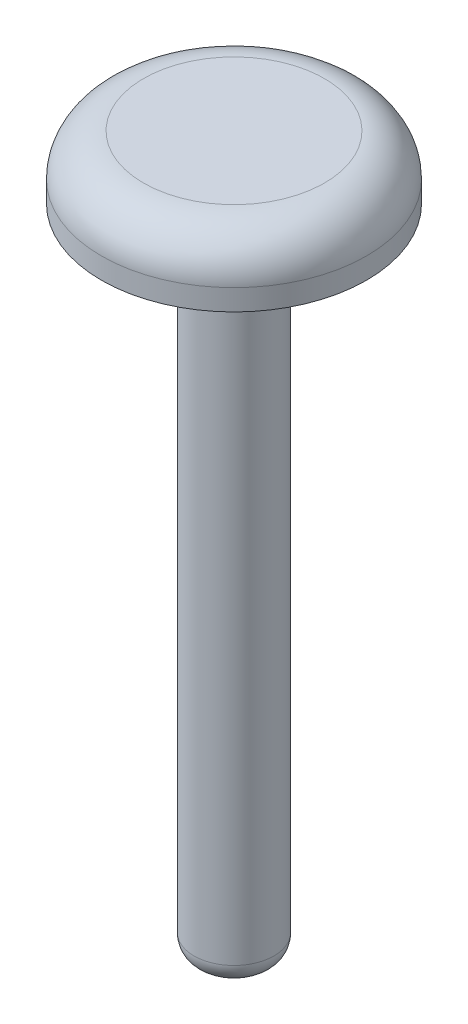
ISO-10303-21;
HEADER;
FILE_DESCRIPTION(('STEP AP214'),'2;1');
FILE_NAME('part.step','',(''),(''),'','','');
FILE_SCHEMA(('AUTOMOTIVE_DESIGN { 1 0 10303 214 1 1 1 1 }'));
ENDSEC;
DATA;
#1=APPLICATION_CONTEXT('core data for automotive mechanical design processes');
#2=APPLICATION_PROTOCOL_DEFINITION('international standard','automotive_design',2000,#1);
#3=PRODUCT_CONTEXT('',#1,'mechanical');
#4=PRODUCT('Part','Part','',(#3));
#5=PRODUCT_RELATED_PRODUCT_CATEGORY('part','',(#4));
#6=PRODUCT_DEFINITION_FORMATION('','',#4);
#7=PRODUCT_DEFINITION_CONTEXT('part definition',#1,'design');
#8=PRODUCT_DEFINITION('design','',#6,#7);
#9=PRODUCT_DEFINITION_SHAPE('','',#8);
#10=(LENGTH_UNIT() NAMED_UNIT(*) SI_UNIT(.MILLI.,.METRE.));
#11=(NAMED_UNIT(*) PLANE_ANGLE_UNIT() SI_UNIT($,.RADIAN.));
#12=(NAMED_UNIT(*) SI_UNIT($,.STERADIAN.) SOLID_ANGLE_UNIT());
#13=UNCERTAINTY_MEASURE_WITH_UNIT(LENGTH_MEASURE(1.E-05),#10,'distance_accuracy_value','');
#14=(GEOMETRIC_REPRESENTATION_CONTEXT(3) GLOBAL_UNCERTAINTY_ASSIGNED_CONTEXT((#13)) GLOBAL_UNIT_ASSIGNED_CONTEXT((#10,
#11,#12)) REPRESENTATION_CONTEXT('',''));
#15=CARTESIAN_POINT('',(0.,0.,0.));
#16=DIRECTION('',(0.,0.,1.));
#17=DIRECTION('',(1.,0.,0.));
#18=AXIS2_PLACEMENT_3D('',#15,#16,#17);
#19=CARTESIAN_POINT('',(0.,15.5,0.));
#20=DIRECTION('',(0.,1.,0.));
#21=DIRECTION('',(0.,0.,1.));
#22=AXIS2_PLACEMENT_3D('',#19,#20,#21);
#23=PLANE('',#22);
#24=CARTESIAN_POINT('',(0.,15.5,0.));
#25=DIRECTION('',(0.,-1.,0.));
#26=DIRECTION('',(0.,0.,-1.));
#27=AXIS2_PLACEMENT_3D('',#24,#25,#26);
#28=CIRCLE('',#27,2.65);
#29=CARTESIAN_POINT('',(0.,15.5,-2.65));
#30=VERTEX_POINT('',#29);
#31=EDGE_CURVE('E54',#30,#30,#28,.T.);
#32=ORIENTED_EDGE('',*,*,#31,.F.);
#33=EDGE_LOOP('',(#32));
#34=FACE_BOUND('',#33,.T.);
#35=CARTESIAN_POINT('',(0.,15.5,0.));
#36=DIRECTION('',(0.,1.,0.));
#37=DIRECTION('',(0.,0.,1.));
#38=AXIS2_PLACEMENT_3D('',#35,#36,#37);
#39=CIRCLE('',#38,3.15);
#40=CARTESIAN_POINT('',(0.,15.5,3.15));
#41=VERTEX_POINT('',#40);
#42=EDGE_CURVE('E50',#41,#41,#39,.T.);
#43=ORIENTED_EDGE('',*,*,#42,.F.);
#44=EDGE_LOOP('',(#43));
#45=FACE_BOUND('',#44,.T.);
#46=ADVANCED_FACE('F30',(#34,#45),#23,.F.);
#47=CARTESIAN_POINT('',(0.,15.5,0.));
#48=DIRECTION('',(0.,1.,0.));
#49=DIRECTION('',(0.,0.,1.));
#50=AXIS2_PLACEMENT_3D('',#47,#48,#49);
#51=CYLINDRICAL_SURFACE('',#50,3.15);
#52=CARTESIAN_POINT('',(0.,16.0001,0.));
#53=DIRECTION('',(0.,1.,0.));
#54=DIRECTION('',(0.,0.,1.));
#55=AXIS2_PLACEMENT_3D('',#52,#53,#54);
#56=CIRCLE('',#55,3.15);
#57=CARTESIAN_POINT('',(0.,16.0001,3.15));
#58=VERTEX_POINT('',#57);
#59=EDGE_CURVE('E10',#58,#58,#56,.F.);
#60=ORIENTED_EDGE('',*,*,#59,.T.);
#61=EDGE_LOOP('',(#60));
#62=FACE_BOUND('',#61,.T.);
#63=ORIENTED_EDGE('',*,*,#42,.T.);
#64=EDGE_LOOP('',(#63));
#65=FACE_BOUND('',#64,.T.);
#66=ADVANCED_FACE('F78',(#62,#65),#51,.T.);
#67=CARTESIAN_POINT('',(0.,17.0001,0.));
#68=DIRECTION('',(0.,1.,0.));
#69=DIRECTION('',(0.,0.,1.));
#70=AXIS2_PLACEMENT_3D('',#67,#68,#69);
#71=PLANE('',#70);
#72=CARTESIAN_POINT('',(0.,17.0001,0.));
#73=DIRECTION('',(0.,1.,0.));
#74=DIRECTION('',(0.,0.,1.));
#75=AXIS2_PLACEMENT_3D('',#72,#73,#74);
#76=CIRCLE('',#75,2.15);
#77=CARTESIAN_POINT('',(0.,17.0001,2.15));
#78=VERTEX_POINT('',#77);
#79=EDGE_CURVE('E37',#78,#78,#76,.T.);
#80=ORIENTED_EDGE('',*,*,#79,.T.);
#81=EDGE_LOOP('',(#80));
#82=FACE_BOUND('',#81,.T.);
#83=ADVANCED_FACE('F84',(#82),#71,.T.);
#84=CARTESIAN_POINT('',(0.,16.0001,0.));
#85=DIRECTION('',(0.,1.,0.));
#86=DIRECTION('',(0.,0.,1.));
#87=AXIS2_PLACEMENT_3D('',#84,#85,#86);
#88=TOROIDAL_SURFACE('',#87,2.15,1.);
#89=ORIENTED_EDGE('',*,*,#59,.F.);
#90=EDGE_LOOP('',(#89));
#91=FACE_BOUND('',#90,.T.);
#92=ORIENTED_EDGE('',*,*,#79,.F.);
#93=EDGE_LOOP('',(#92));
#94=FACE_BOUND('',#93,.T.);
#95=ADVANCED_FACE('F32',(#91,#94),#88,.T.);
#96=CARTESIAN_POINT('',(0.,16.5,0.));
#97=DIRECTION('',(0.,-1.,0.));
#98=DIRECTION('',(0.,0.,-1.));
#99=AXIS2_PLACEMENT_3D('',#96,#97,#98);
#100=CYLINDRICAL_SURFACE('',#99,2.65);
#101=CARTESIAN_POINT('',(0.,16.5,0.));
#102=DIRECTION('',(0.,-1.,0.));
#103=DIRECTION('',(0.,0.,-1.));
#104=AXIS2_PLACEMENT_3D('',#101,#102,#103);
#105=CIRCLE('',#104,2.65);
#106=CARTESIAN_POINT('',(0.,16.5,-2.65));
#107=VERTEX_POINT('',#106);
#108=EDGE_CURVE('E53',#107,#107,#105,.T.);
#109=ORIENTED_EDGE('',*,*,#108,.F.);
#110=EDGE_LOOP('',(#109));
#111=FACE_BOUND('',#110,.T.);
#112=ORIENTED_EDGE('',*,*,#31,.T.);
#113=EDGE_LOOP('',(#112));
#114=FACE_BOUND('',#113,.T.);
#115=ADVANCED_FACE('F95',(#111,#114),#100,.F.);
#116=CARTESIAN_POINT('',(0.,16.5,0.));
#117=DIRECTION('',(0.,-1.,0.));
#118=DIRECTION('',(0.,0.,-1.));
#119=AXIS2_PLACEMENT_3D('',#116,#117,#118);
#120=PLANE('',#119);
#121=CARTESIAN_POINT('',(0.,16.5,0.));
#122=DIRECTION('',(0.,-1.,0.));
#123=DIRECTION('',(0.,0.,-1.));
#124=AXIS2_PLACEMENT_3D('',#121,#122,#123);
#125=CIRCLE('',#124,0.95);
#126=CARTESIAN_POINT('',(0.,16.5,-0.95));
#127=VERTEX_POINT('',#126);
#128=EDGE_CURVE('E57',#127,#127,#125,.F.);
#129=ORIENTED_EDGE('',*,*,#128,.T.);
#130=EDGE_LOOP('',(#129));
#131=FACE_BOUND('',#130,.T.);
#132=ORIENTED_EDGE('',*,*,#108,.T.);
#133=EDGE_LOOP('',(#132));
#134=FACE_BOUND('',#133,.T.);
#135=ADVANCED_FACE('F63',(#131,#134),#120,.T.);
#136=CARTESIAN_POINT('',(0.,0.,0.));
#137=DIRECTION('',(0.,1.,0.));
#138=DIRECTION('',(0.,0.,1.));
#139=AXIS2_PLACEMENT_3D('',#136,#137,#138);
#140=PLANE('',#139);
#141=CARTESIAN_POINT('',(0.,0.,0.));
#142=DIRECTION('',(0.,1.,0.));
#143=DIRECTION('',(0.,0.,1.));
#144=AXIS2_PLACEMENT_3D('',#141,#142,#143);
#145=CIRCLE('',#144,0.449999999999999);
#146=CARTESIAN_POINT('',(0.,0.,0.449999999999999));
#147=VERTEX_POINT('',#146);
#148=EDGE_CURVE('E41',#147,#147,#145,.F.);
#149=ORIENTED_EDGE('',*,*,#148,.T.);
#150=EDGE_LOOP('',(#149));
#151=FACE_BOUND('',#150,.T.);
#152=ADVANCED_FACE('F74',(#151),#140,.F.);
#153=CARTESIAN_POINT('',(0.,0.5,0.));
#154=DIRECTION('',(0.,1.,0.));
#155=DIRECTION('',(0.,0.,1.));
#156=AXIS2_PLACEMENT_3D('',#153,#154,#155);
#157=DEGENERATE_TOROIDAL_SURFACE('',#156,0.449999999999999,0.5,.T.);
#158=ORIENTED_EDGE('',*,*,#148,.F.);
#159=EDGE_LOOP('',(#158));
#160=FACE_BOUND('',#159,.T.);
#161=CARTESIAN_POINT('',(0.,0.5,0.));
#162=DIRECTION('',(0.,1.,0.));
#163=DIRECTION('',(0.,0.,1.));
#164=AXIS2_PLACEMENT_3D('',#161,#162,#163);
#165=CIRCLE('',#164,0.95);
#166=CARTESIAN_POINT('',(0.,0.5,0.95));
#167=VERTEX_POINT('',#166);
#168=EDGE_CURVE('E45',#167,#167,#165,.T.);
#169=ORIENTED_EDGE('',*,*,#168,.F.);
#170=EDGE_LOOP('',(#169));
#171=FACE_BOUND('',#170,.T.);
#172=ADVANCED_FACE('F68',(#160,#171),#157,.T.);
#173=CARTESIAN_POINT('',(0.,17.,0.));
#174=DIRECTION('',(0.,-1.,0.));
#175=DIRECTION('',(0.,0.,-1.));
#176=AXIS2_PLACEMENT_3D('',#173,#174,#175);
#177=CYLINDRICAL_SURFACE('',#176,0.95);
#178=ORIENTED_EDGE('',*,*,#168,.T.);
#179=EDGE_LOOP('',(#178));
#180=FACE_BOUND('',#179,.T.);
#181=ORIENTED_EDGE('',*,*,#128,.F.);
#182=EDGE_LOOP('',(#181));
#183=FACE_BOUND('',#182,.T.);
#184=ADVANCED_FACE('F66',(#180,#183),#177,.T.);
#185=CLOSED_SHELL('',(#46,#66,#83,#95,#115,#135,#152,#172,#184));
#186=MANIFOLD_SOLID_BREP('B2',#185);
#187=ADVANCED_BREP_SHAPE_REPRESENTATION('',(#18,#186),#14);
#188=SHAPE_DEFINITION_REPRESENTATION(#9,#187);
ENDSEC;
END-ISO-10303-21;
